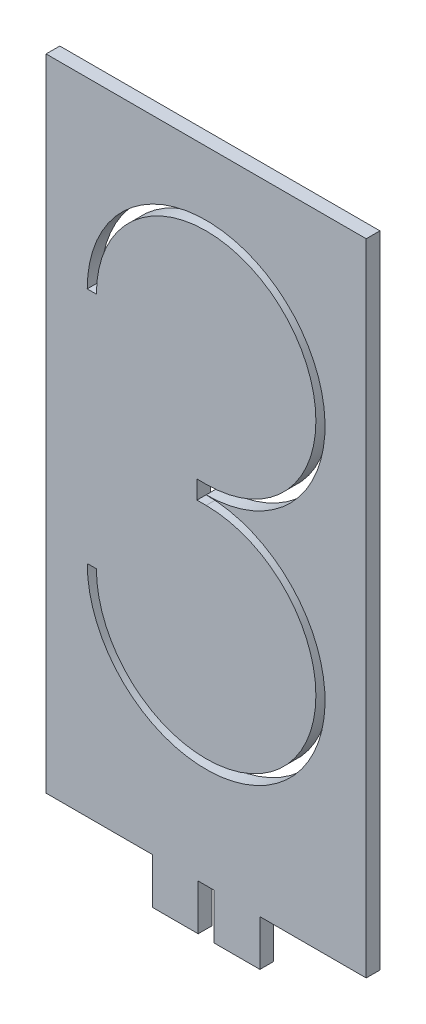
ISO-10303-21;
HEADER;
FILE_DESCRIPTION(('STEP AP214'),'2;1');
FILE_NAME('part.step','',(''),(''),'','','');
FILE_SCHEMA(('AUTOMOTIVE_DESIGN { 1 0 10303 214 1 1 1 1 }'));
ENDSEC;
DATA;
#1=APPLICATION_CONTEXT('core data for automotive mechanical design processes');
#2=APPLICATION_PROTOCOL_DEFINITION('international standard','automotive_design',2000,#1);
#3=PRODUCT_CONTEXT('',#1,'mechanical');
#4=PRODUCT('Part','Part','',(#3));
#5=PRODUCT_RELATED_PRODUCT_CATEGORY('part','',(#4));
#6=PRODUCT_DEFINITION_FORMATION('','',#4);
#7=PRODUCT_DEFINITION_CONTEXT('part definition',#1,'design');
#8=PRODUCT_DEFINITION('design','',#6,#7);
#9=PRODUCT_DEFINITION_SHAPE('','',#8);
#10=(LENGTH_UNIT() NAMED_UNIT(*) SI_UNIT(.MILLI.,.METRE.));
#11=(NAMED_UNIT(*) PLANE_ANGLE_UNIT() SI_UNIT($,.RADIAN.));
#12=(NAMED_UNIT(*) SI_UNIT($,.STERADIAN.) SOLID_ANGLE_UNIT());
#13=UNCERTAINTY_MEASURE_WITH_UNIT(LENGTH_MEASURE(1.E-05),#10,'distance_accuracy_value','');
#14=(GEOMETRIC_REPRESENTATION_CONTEXT(3) GLOBAL_UNCERTAINTY_ASSIGNED_CONTEXT((#13)) GLOBAL_UNIT_ASSIGNED_CONTEXT((#10,
#11,#12)) REPRESENTATION_CONTEXT('',''));
#15=CARTESIAN_POINT('',(0.,0.,0.));
#16=DIRECTION('',(0.,0.,1.));
#17=DIRECTION('',(1.,0.,0.));
#18=AXIS2_PLACEMENT_3D('',#15,#16,#17);
#19=CARTESIAN_POINT('',(0.,0.,1.5));
#20=DIRECTION('',(0.,1.,0.));
#21=DIRECTION('',(0.,0.,1.));
#22=AXIS2_PLACEMENT_3D('',#19,#20,#21);
#23=PLANE('',#22);
#24=DIRECTION('',(1.,0.,0.));
#25=VECTOR('',#24,1.);
#26=CARTESIAN_POINT('',(0.,0.,1.5));
#27=LINE('',#26,#25);
#28=CARTESIAN_POINT('',(11.63,0.,1.5));
#29=VERTEX_POINT('',#28);
#30=CARTESIAN_POINT('',(16.63,0.,1.5));
#31=VERTEX_POINT('',#30);
#32=EDGE_CURVE('E349',#29,#31,#27,.T.);
#33=ORIENTED_EDGE('',*,*,#32,.F.);
#34=DIRECTION('',(0.,0.,1.));
#35=VECTOR('',#34,1.);
#36=CARTESIAN_POINT('',(11.63,0.,0.));
#37=LINE('',#36,#35);
#38=CARTESIAN_POINT('',(11.63,0.,0.));
#39=VERTEX_POINT('',#38);
#40=EDGE_CURVE('E263',#39,#29,#37,.T.);
#41=ORIENTED_EDGE('',*,*,#40,.F.);
#42=DIRECTION('',(1.,0.,0.));
#43=VECTOR('',#42,1.);
#44=CARTESIAN_POINT('',(0.,0.,0.));
#45=LINE('',#44,#43);
#46=CARTESIAN_POINT('',(16.63,0.,0.));
#47=VERTEX_POINT('',#46);
#48=EDGE_CURVE('E364',#39,#47,#45,.T.);
#49=ORIENTED_EDGE('',*,*,#48,.T.);
#50=DIRECTION('',(0.,0.,1.));
#51=VECTOR('',#50,1.);
#52=CARTESIAN_POINT('',(16.63,0.,0.));
#53=LINE('',#52,#51);
#54=EDGE_CURVE('E319',#47,#31,#53,.T.);
#55=ORIENTED_EDGE('',*,*,#54,.T.);
#56=EDGE_LOOP('',(#33,#41,#49,#55));
#57=FACE_BOUND('',#56,.T.);
#58=ADVANCED_FACE('F39',(#57),#23,.F.);
#59=CARTESIAN_POINT('',(0.,0.,1.5));
#60=DIRECTION('',(1.,0.,0.));
#61=DIRECTION('',(0.,1.,0.));
#62=AXIS2_PLACEMENT_3D('',#59,#60,#61);
#63=PLANE('',#62);
#64=DIRECTION('',(0.,-1.,0.));
#65=VECTOR('',#64,1.);
#66=CARTESIAN_POINT('',(0.,0.,0.));
#67=LINE('',#66,#65);
#68=CARTESIAN_POINT('',(0.,75.,0.));
#69=VERTEX_POINT('',#68);
#70=CARTESIAN_POINT('',(0.,5.,0.));
#71=VERTEX_POINT('',#70);
#72=EDGE_CURVE('E275',#69,#71,#67,.T.);
#73=ORIENTED_EDGE('',*,*,#72,.T.);
#74=DIRECTION('',(0.,0.,1.));
#75=VECTOR('',#74,1.);
#76=CARTESIAN_POINT('',(0.,5.,0.));
#77=LINE('',#76,#75);
#78=CARTESIAN_POINT('',(0.,5.,1.5));
#79=VERTEX_POINT('',#78);
#80=EDGE_CURVE('E271',#71,#79,#77,.T.);
#81=ORIENTED_EDGE('',*,*,#80,.T.);
#82=DIRECTION('',(0.,-1.,0.));
#83=VECTOR('',#82,1.);
#84=CARTESIAN_POINT('',(0.,0.,1.5));
#85=LINE('',#84,#83);
#86=CARTESIAN_POINT('',(0.,75.,1.5));
#87=VERTEX_POINT('',#86);
#88=EDGE_CURVE('E340',#87,#79,#85,.T.);
#89=ORIENTED_EDGE('',*,*,#88,.F.);
#90=DIRECTION('',(0.,0.,-1.));
#91=VECTOR('',#90,1.);
#92=CARTESIAN_POINT('',(0.,75.,1.5));
#93=LINE('',#92,#91);
#94=EDGE_CURVE('E356',#87,#69,#93,.T.);
#95=ORIENTED_EDGE('',*,*,#94,.T.);
#96=EDGE_LOOP('',(#73,#81,#89,#95));
#97=FACE_BOUND('',#96,.T.);
#98=ADVANCED_FACE('F41',(#97),#63,.F.);
#99=CARTESIAN_POINT('',(18.38,0.,0.));
#100=VERTEX_POINT('',#99);
#101=CARTESIAN_POINT('',(23.38,0.,0.));
#102=VERTEX_POINT('',#101);
#103=EDGE_CURVE('E360',#100,#102,#45,.T.);
#104=ORIENTED_EDGE('',*,*,#103,.T.);
#105=DIRECTION('',(0.,0.,1.));
#106=VECTOR('',#105,1.);
#107=CARTESIAN_POINT('',(23.38,0.,0.));
#108=LINE('',#107,#106);
#109=CARTESIAN_POINT('',(23.38,0.,1.5));
#110=VERTEX_POINT('',#109);
#111=EDGE_CURVE('E290',#102,#110,#108,.T.);
#112=ORIENTED_EDGE('',*,*,#111,.T.);
#113=CARTESIAN_POINT('',(18.38,0.,1.5));
#114=VERTEX_POINT('',#113);
#115=EDGE_CURVE('E344',#114,#110,#27,.T.);
#116=ORIENTED_EDGE('',*,*,#115,.F.);
#117=DIRECTION('',(0.,0.,1.));
#118=VECTOR('',#117,1.);
#119=CARTESIAN_POINT('',(18.38,0.,0.));
#120=LINE('',#119,#118);
#121=EDGE_CURVE('E334',#100,#114,#120,.T.);
#122=ORIENTED_EDGE('',*,*,#121,.F.);
#123=EDGE_LOOP('',(#104,#112,#116,#122));
#124=FACE_BOUND('',#123,.T.);
#125=ADVANCED_FACE('F446',(#124),#23,.F.);
#126=CARTESIAN_POINT('',(35.,0.,1.5));
#127=DIRECTION('',(-1.,0.,0.));
#128=DIRECTION('',(0.,-1.,0.));
#129=AXIS2_PLACEMENT_3D('',#126,#127,#128);
#130=PLANE('',#129);
#131=DIRECTION('',(0.,1.,0.));
#132=VECTOR('',#131,1.);
#133=CARTESIAN_POINT('',(35.,0.,1.5));
#134=LINE('',#133,#132);
#135=CARTESIAN_POINT('',(35.,5.,1.5));
#136=VERTEX_POINT('',#135);
#137=CARTESIAN_POINT('',(35.,75.,1.5));
#138=VERTEX_POINT('',#137);
#139=EDGE_CURVE('E350',#136,#138,#134,.T.);
#140=ORIENTED_EDGE('',*,*,#139,.F.);
#141=DIRECTION('',(0.,0.,1.));
#142=VECTOR('',#141,1.);
#143=CARTESIAN_POINT('',(35.,5.,0.));
#144=LINE('',#143,#142);
#145=CARTESIAN_POINT('',(35.,5.,0.));
#146=VERTEX_POINT('',#145);
#147=EDGE_CURVE('E300',#146,#136,#144,.T.);
#148=ORIENTED_EDGE('',*,*,#147,.F.);
#149=DIRECTION('',(0.,1.,0.));
#150=VECTOR('',#149,1.);
#151=CARTESIAN_POINT('',(35.,0.,0.));
#152=LINE('',#151,#150);
#153=CARTESIAN_POINT('',(35.,75.,0.));
#154=VERTEX_POINT('',#153);
#155=EDGE_CURVE('E365',#146,#154,#152,.T.);
#156=ORIENTED_EDGE('',*,*,#155,.T.);
#157=DIRECTION('',(0.,0.,-1.));
#158=VECTOR('',#157,1.);
#159=CARTESIAN_POINT('',(35.,75.,1.5));
#160=LINE('',#159,#158);
#161=EDGE_CURVE('E373',#138,#154,#160,.T.);
#162=ORIENTED_EDGE('',*,*,#161,.F.);
#163=EDGE_LOOP('',(#140,#148,#156,#162));
#164=FACE_BOUND('',#163,.T.);
#165=ADVANCED_FACE('F454',(#164),#130,.F.);
#166=CARTESIAN_POINT('',(0.,75.,1.5));
#167=DIRECTION('',(0.,-1.,0.));
#168=DIRECTION('',(0.,0.,-1.));
#169=AXIS2_PLACEMENT_3D('',#166,#167,#168);
#170=PLANE('',#169);
#171=DIRECTION('',(-1.,0.,0.));
#172=VECTOR('',#171,1.);
#173=CARTESIAN_POINT('',(0.,75.,0.));
#174=LINE('',#173,#172);
#175=EDGE_CURVE('E345',#154,#69,#174,.T.);
#176=ORIENTED_EDGE('',*,*,#175,.T.);
#177=ORIENTED_EDGE('',*,*,#94,.F.);
#178=DIRECTION('',(-1.,0.,0.));
#179=VECTOR('',#178,1.);
#180=CARTESIAN_POINT('',(0.,75.,1.5));
#181=LINE('',#180,#179);
#182=EDGE_CURVE('E353',#138,#87,#181,.T.);
#183=ORIENTED_EDGE('',*,*,#182,.F.);
#184=ORIENTED_EDGE('',*,*,#161,.T.);
#185=EDGE_LOOP('',(#176,#177,#183,#184));
#186=FACE_BOUND('',#185,.T.);
#187=ADVANCED_FACE('F459',(#186),#170,.F.);
#188=CARTESIAN_POINT('',(0.,0.,1.5));
#189=DIRECTION('',(0.,0.,-1.));
#190=DIRECTION('',(-1.,0.,0.));
#191=AXIS2_PLACEMENT_3D('',#188,#189,#190);
#192=PLANE('',#191);
#193=DIRECTION('',(1.,0.,0.));
#194=VECTOR('',#193,1.);
#195=CARTESIAN_POINT('',(5.49999999999997,55.,1.5));
#196=LINE('',#195,#194);
#197=CARTESIAN_POINT('',(4.5,55.,1.5));
#198=VERTEX_POINT('',#197);
#199=CARTESIAN_POINT('',(5.49999999999997,55.,1.5));
#200=VERTEX_POINT('',#199);
#201=EDGE_CURVE('E195',#198,#200,#196,.T.);
#202=ORIENTED_EDGE('',*,*,#201,.F.);
#203=CARTESIAN_POINT('',(17.5,55.,1.5));
#204=DIRECTION('',(0.,0.,1.));
#205=DIRECTION('',(-1.,0.,0.));
#206=AXIS2_PLACEMENT_3D('',#203,#204,#205);
#207=CIRCLE('',#206,13.);
#208=CARTESIAN_POINT('',(17.5,42.,1.5));
#209=VERTEX_POINT('',#208);
#210=EDGE_CURVE('E55',#209,#198,#207,.T.);
#211=ORIENTED_EDGE('',*,*,#210,.F.);
#212=CARTESIAN_POINT('',(17.5,29.,1.5));
#213=DIRECTION('',(0.,0.,1.));
#214=DIRECTION('',(-1.,0.,0.));
#215=AXIS2_PLACEMENT_3D('',#212,#213,#214);
#216=CIRCLE('',#215,13.);
#217=CARTESIAN_POINT('',(4.49999999999997,29.,1.5));
#218=VERTEX_POINT('',#217);
#219=EDGE_CURVE('E227',#218,#209,#216,.T.);
#220=ORIENTED_EDGE('',*,*,#219,.F.);
#221=DIRECTION('',(-1.,0.,0.));
#222=VECTOR('',#221,1.);
#223=CARTESIAN_POINT('',(5.49999999999997,29.,1.5));
#224=LINE('',#223,#222);
#225=CARTESIAN_POINT('',(5.49999999999997,29.,1.5));
#226=VERTEX_POINT('',#225);
#227=EDGE_CURVE('E223',#226,#218,#224,.T.);
#228=ORIENTED_EDGE('',*,*,#227,.F.);
#229=CARTESIAN_POINT('',(17.5,29.,1.5));
#230=DIRECTION('',(0.,0.,-1.));
#231=DIRECTION('',(1.,0.,0.));
#232=AXIS2_PLACEMENT_3D('',#229,#230,#231);
#233=CIRCLE('',#232,12.);
#234=CARTESIAN_POINT('',(17.5,41.,1.5));
#235=VERTEX_POINT('',#234);
#236=EDGE_CURVE('E219',#235,#226,#233,.T.);
#237=ORIENTED_EDGE('',*,*,#236,.F.);
#238=DIRECTION('',(1.,0.,0.));
#239=VECTOR('',#238,1.);
#240=CARTESIAN_POINT('',(16.5,41.,1.5));
#241=LINE('',#240,#239);
#242=CARTESIAN_POINT('',(16.5,41.,1.5));
#243=VERTEX_POINT('',#242);
#244=EDGE_CURVE('E215',#243,#235,#241,.T.);
#245=ORIENTED_EDGE('',*,*,#244,.F.);
#246=DIRECTION('',(0.,-1.,0.));
#247=VECTOR('',#246,1.);
#248=CARTESIAN_POINT('',(16.5,43.,1.5));
#249=LINE('',#248,#247);
#250=CARTESIAN_POINT('',(16.5,43.,1.5));
#251=VERTEX_POINT('',#250);
#252=EDGE_CURVE('E208',#251,#243,#249,.T.);
#253=ORIENTED_EDGE('',*,*,#252,.F.);
#254=DIRECTION('',(-1.,0.,0.));
#255=VECTOR('',#254,1.);
#256=CARTESIAN_POINT('',(16.5,43.,1.5));
#257=LINE('',#256,#255);
#258=CARTESIAN_POINT('',(17.5,43.,1.5));
#259=VERTEX_POINT('',#258);
#260=EDGE_CURVE('E204',#259,#251,#257,.T.);
#261=ORIENTED_EDGE('',*,*,#260,.F.);
#262=CARTESIAN_POINT('',(17.5,55.,1.5));
#263=DIRECTION('',(0.,0.,-1.));
#264=DIRECTION('',(-1.,0.,0.));
#265=AXIS2_PLACEMENT_3D('',#262,#263,#264);
#266=CIRCLE('',#265,12.);
#267=EDGE_CURVE('E185',#200,#259,#266,.T.);
#268=ORIENTED_EDGE('',*,*,#267,.F.);
#269=EDGE_LOOP('',(#202,#211,#220,#228,#237,#245,#253,#261,#268));
#270=FACE_BOUND('',#269,.T.);
#271=ORIENTED_EDGE('',*,*,#88,.T.);
#272=DIRECTION('',(-1.,0.,0.));
#273=VECTOR('',#272,1.);
#274=CARTESIAN_POINT('',(0.,5.,1.5));
#275=LINE('',#274,#273);
#276=CARTESIAN_POINT('',(11.63,5.,1.5));
#277=VERTEX_POINT('',#276);
#278=EDGE_CURVE('E259',#277,#79,#275,.T.);
#279=ORIENTED_EDGE('',*,*,#278,.F.);
#280=DIRECTION('',(0.,1.,0.));
#281=VECTOR('',#280,1.);
#282=CARTESIAN_POINT('',(11.63,0.,1.5));
#283=LINE('',#282,#281);
#284=EDGE_CURVE('E264',#29,#277,#283,.T.);
#285=ORIENTED_EDGE('',*,*,#284,.F.);
#286=ORIENTED_EDGE('',*,*,#32,.T.);
#287=DIRECTION('',(0.,-1.,0.));
#288=VECTOR('',#287,1.);
#289=CARTESIAN_POINT('',(16.63,0.,1.5));
#290=LINE('',#289,#288);
#291=CARTESIAN_POINT('',(16.63,5.,1.5));
#292=VERTEX_POINT('',#291);
#293=EDGE_CURVE('E234',#292,#31,#290,.T.);
#294=ORIENTED_EDGE('',*,*,#293,.F.);
#295=DIRECTION('',(-1.,0.,0.));
#296=VECTOR('',#295,1.);
#297=CARTESIAN_POINT('',(16.63,5.,1.5));
#298=LINE('',#297,#296);
#299=CARTESIAN_POINT('',(18.38,5.,1.5));
#300=VERTEX_POINT('',#299);
#301=EDGE_CURVE('E311',#300,#292,#298,.T.);
#302=ORIENTED_EDGE('',*,*,#301,.F.);
#303=DIRECTION('',(0.,1.,0.));
#304=VECTOR('',#303,1.);
#305=CARTESIAN_POINT('',(18.38,0.,1.5));
#306=LINE('',#305,#304);
#307=EDGE_CURVE('E322',#114,#300,#306,.T.);
#308=ORIENTED_EDGE('',*,*,#307,.F.);
#309=ORIENTED_EDGE('',*,*,#115,.T.);
#310=DIRECTION('',(0.,-1.,0.));
#311=VECTOR('',#310,1.);
#312=CARTESIAN_POINT('',(23.38,5.,1.5));
#313=LINE('',#312,#311);
#314=CARTESIAN_POINT('',(23.38,5.,1.5));
#315=VERTEX_POINT('',#314);
#316=EDGE_CURVE('E291',#315,#110,#313,.T.);
#317=ORIENTED_EDGE('',*,*,#316,.F.);
#318=DIRECTION('',(-1.,0.,0.));
#319=VECTOR('',#318,1.);
#320=CARTESIAN_POINT('',(23.38,5.,1.5));
#321=LINE('',#320,#319);
#322=EDGE_CURVE('E286',#136,#315,#321,.T.);
#323=ORIENTED_EDGE('',*,*,#322,.F.);
#324=ORIENTED_EDGE('',*,*,#139,.T.);
#325=ORIENTED_EDGE('',*,*,#182,.T.);
#326=EDGE_LOOP('',(#271,#279,#285,#286,#294,#302,#308,#309,#317,#323,#324,#325));
#327=FACE_BOUND('',#326,.T.);
#328=ADVANCED_FACE('F200',(#270,#327),#192,.F.);
#329=CARTESIAN_POINT('',(0.,0.,0.));
#330=DIRECTION('',(0.,0.,-1.));
#331=DIRECTION('',(-1.,0.,0.));
#332=AXIS2_PLACEMENT_3D('',#329,#330,#331);
#333=PLANE('',#332);
#334=CARTESIAN_POINT('',(17.5,55.,0.));
#335=DIRECTION('',(0.,0.,-1.));
#336=DIRECTION('',(-1.,0.,0.));
#337=AXIS2_PLACEMENT_3D('',#334,#335,#336);
#338=CIRCLE('',#337,13.);
#339=CARTESIAN_POINT('',(4.5,55.,0.));
#340=VERTEX_POINT('',#339);
#341=CARTESIAN_POINT('',(17.5,42.,0.));
#342=VERTEX_POINT('',#341);
#343=EDGE_CURVE('E11',#340,#342,#338,.T.);
#344=ORIENTED_EDGE('',*,*,#343,.F.);
#345=DIRECTION('',(-1.,0.,0.));
#346=VECTOR('',#345,1.);
#347=CARTESIAN_POINT('',(7.63278329429823E-13,55.0000000000001,0.));
#348=LINE('',#347,#346);
#349=CARTESIAN_POINT('',(5.49999999999997,55.,0.));
#350=VERTEX_POINT('',#349);
#351=EDGE_CURVE('E377',#350,#340,#348,.T.);
#352=ORIENTED_EDGE('',*,*,#351,.F.);
#353=CARTESIAN_POINT('',(17.5,55.,0.));
#354=DIRECTION('',(0.,0.,-1.));
#355=DIRECTION('',(-1.,0.,0.));
#356=AXIS2_PLACEMENT_3D('',#353,#354,#355);
#357=CIRCLE('',#356,12.);
#358=CARTESIAN_POINT('',(17.5,43.,0.));
#359=VERTEX_POINT('',#358);
#360=EDGE_CURVE('E188',#359,#350,#357,.F.);
#361=ORIENTED_EDGE('',*,*,#360,.F.);
#362=DIRECTION('',(1.,0.,0.));
#363=VECTOR('',#362,1.);
#364=CARTESIAN_POINT('',(0.,43.,0.));
#365=LINE('',#364,#363);
#366=CARTESIAN_POINT('',(16.5,43.,0.));
#367=VERTEX_POINT('',#366);
#368=EDGE_CURVE('E382',#367,#359,#365,.T.);
#369=ORIENTED_EDGE('',*,*,#368,.F.);
#370=DIRECTION('',(0.,1.,0.));
#371=VECTOR('',#370,1.);
#372=CARTESIAN_POINT('',(16.5,0.,0.));
#373=LINE('',#372,#371);
#374=CARTESIAN_POINT('',(16.5,41.,0.));
#375=VERTEX_POINT('',#374);
#376=EDGE_CURVE('E385',#375,#367,#373,.T.);
#377=ORIENTED_EDGE('',*,*,#376,.F.);
#378=DIRECTION('',(-1.,0.,0.));
#379=VECTOR('',#378,1.);
#380=CARTESIAN_POINT('',(0.,41.,0.));
#381=LINE('',#380,#379);
#382=CARTESIAN_POINT('',(17.5,41.,0.));
#383=VERTEX_POINT('',#382);
#384=EDGE_CURVE('E388',#383,#375,#381,.T.);
#385=ORIENTED_EDGE('',*,*,#384,.F.);
#386=CARTESIAN_POINT('',(17.5,29.,0.));
#387=DIRECTION('',(0.,0.,-1.));
#388=DIRECTION('',(-1.,0.,0.));
#389=AXIS2_PLACEMENT_3D('',#386,#387,#388);
#390=CIRCLE('',#389,12.);
#391=CARTESIAN_POINT('',(5.49999999999997,29.,0.));
#392=VERTEX_POINT('',#391);
#393=EDGE_CURVE('E391',#392,#383,#390,.F.);
#394=ORIENTED_EDGE('',*,*,#393,.F.);
#395=DIRECTION('',(1.,0.,0.));
#396=VECTOR('',#395,1.);
#397=CARTESIAN_POINT('',(8.04911692853243E-13,29.0000000000001,0.));
#398=LINE('',#397,#396);
#399=CARTESIAN_POINT('',(4.49999999999997,29.,0.));
#400=VERTEX_POINT('',#399);
#401=EDGE_CURVE('E394',#400,#392,#398,.T.);
#402=ORIENTED_EDGE('',*,*,#401,.F.);
#403=CARTESIAN_POINT('',(17.5,29.,0.));
#404=DIRECTION('',(0.,0.,-1.));
#405=DIRECTION('',(-1.,0.,0.));
#406=AXIS2_PLACEMENT_3D('',#403,#404,#405);
#407=CIRCLE('',#406,13.);
#408=EDGE_CURVE('E48',#342,#400,#407,.T.);
#409=ORIENTED_EDGE('',*,*,#408,.F.);
#410=EDGE_LOOP('',(#344,#352,#361,#369,#377,#385,#394,#402,#409));
#411=FACE_BOUND('',#410,.T.);
#412=DIRECTION('',(-1.,0.,0.));
#413=VECTOR('',#412,1.);
#414=CARTESIAN_POINT('',(0.,5.,0.));
#415=LINE('',#414,#413);
#416=CARTESIAN_POINT('',(11.63,5.,0.));
#417=VERTEX_POINT('',#416);
#418=EDGE_CURVE('E258',#417,#71,#415,.T.);
#419=ORIENTED_EDGE('',*,*,#418,.T.);
#420=ORIENTED_EDGE('',*,*,#72,.F.);
#421=ORIENTED_EDGE('',*,*,#175,.F.);
#422=ORIENTED_EDGE('',*,*,#155,.F.);
#423=DIRECTION('',(-1.,0.,0.));
#424=VECTOR('',#423,1.);
#425=CARTESIAN_POINT('',(23.38,5.,0.));
#426=LINE('',#425,#424);
#427=CARTESIAN_POINT('',(23.38,5.,0.));
#428=VERTEX_POINT('',#427);
#429=EDGE_CURVE('E285',#146,#428,#426,.T.);
#430=ORIENTED_EDGE('',*,*,#429,.T.);
#431=DIRECTION('',(0.,-1.,0.));
#432=VECTOR('',#431,1.);
#433=CARTESIAN_POINT('',(23.38,5.,0.));
#434=LINE('',#433,#432);
#435=EDGE_CURVE('E281',#428,#102,#434,.T.);
#436=ORIENTED_EDGE('',*,*,#435,.T.);
#437=ORIENTED_EDGE('',*,*,#103,.F.);
#438=DIRECTION('',(0.,1.,0.));
#439=VECTOR('',#438,1.);
#440=CARTESIAN_POINT('',(18.38,0.,0.));
#441=LINE('',#440,#439);
#442=CARTESIAN_POINT('',(18.38,5.,0.));
#443=VERTEX_POINT('',#442);
#444=EDGE_CURVE('E310',#100,#443,#441,.T.);
#445=ORIENTED_EDGE('',*,*,#444,.T.);
#446=DIRECTION('',(-1.,0.,0.));
#447=VECTOR('',#446,1.);
#448=CARTESIAN_POINT('',(16.63,5.,0.));
#449=LINE('',#448,#447);
#450=CARTESIAN_POINT('',(16.63,5.,0.));
#451=VERTEX_POINT('',#450);
#452=EDGE_CURVE('E315',#443,#451,#449,.T.);
#453=ORIENTED_EDGE('',*,*,#452,.T.);
#454=DIRECTION('',(0.,-1.,0.));
#455=VECTOR('',#454,1.);
#456=CARTESIAN_POINT('',(16.63,0.,0.));
#457=LINE('',#456,#455);
#458=EDGE_CURVE('E306',#451,#47,#457,.T.);
#459=ORIENTED_EDGE('',*,*,#458,.T.);
#460=ORIENTED_EDGE('',*,*,#48,.F.);
#461=DIRECTION('',(0.,1.,0.));
#462=VECTOR('',#461,1.);
#463=CARTESIAN_POINT('',(11.63,0.,0.));
#464=LINE('',#463,#462);
#465=EDGE_CURVE('E254',#39,#417,#464,.T.);
#466=ORIENTED_EDGE('',*,*,#465,.T.);
#467=EDGE_LOOP('',(#419,#420,#421,#422,#430,#436,#437,#445,#453,#459,#460,#466));
#468=FACE_BOUND('',#467,.T.);
#469=ADVANCED_FACE('F411',(#411,#468),#333,.T.);
#470=CARTESIAN_POINT('',(16.63,0.,0.));
#471=DIRECTION('',(-1.,0.,0.));
#472=DIRECTION('',(0.,0.,1.));
#473=AXIS2_PLACEMENT_3D('',#470,#471,#472);
#474=PLANE('',#473);
#475=ORIENTED_EDGE('',*,*,#293,.T.);
#476=ORIENTED_EDGE('',*,*,#54,.F.);
#477=ORIENTED_EDGE('',*,*,#458,.F.);
#478=DIRECTION('',(0.,0.,1.));
#479=VECTOR('',#478,1.);
#480=CARTESIAN_POINT('',(16.63,5.,0.));
#481=LINE('',#480,#479);
#482=EDGE_CURVE('E294',#451,#292,#481,.T.);
#483=ORIENTED_EDGE('',*,*,#482,.T.);
#484=EDGE_LOOP('',(#475,#476,#477,#483));
#485=FACE_BOUND('',#484,.T.);
#486=ADVANCED_FACE('F509',(#485),#474,.F.);
#487=CARTESIAN_POINT('',(16.63,5.,0.));
#488=DIRECTION('',(0.,1.,0.));
#489=DIRECTION('',(0.,0.,1.));
#490=AXIS2_PLACEMENT_3D('',#487,#488,#489);
#491=PLANE('',#490);
#492=ORIENTED_EDGE('',*,*,#301,.T.);
#493=ORIENTED_EDGE('',*,*,#482,.F.);
#494=ORIENTED_EDGE('',*,*,#452,.F.);
#495=DIRECTION('',(0.,0.,1.));
#496=VECTOR('',#495,1.);
#497=CARTESIAN_POINT('',(18.38,5.,0.));
#498=LINE('',#497,#496);
#499=EDGE_CURVE('E331',#443,#300,#498,.T.);
#500=ORIENTED_EDGE('',*,*,#499,.T.);
#501=EDGE_LOOP('',(#492,#493,#494,#500));
#502=FACE_BOUND('',#501,.T.);
#503=ADVANCED_FACE('F481',(#502),#491,.F.);
#504=CARTESIAN_POINT('',(18.38,0.,0.));
#505=DIRECTION('',(1.,0.,0.));
#506=DIRECTION('',(0.,0.,-1.));
#507=AXIS2_PLACEMENT_3D('',#504,#505,#506);
#508=PLANE('',#507);
#509=ORIENTED_EDGE('',*,*,#307,.T.);
#510=ORIENTED_EDGE('',*,*,#499,.F.);
#511=ORIENTED_EDGE('',*,*,#444,.F.);
#512=ORIENTED_EDGE('',*,*,#121,.T.);
#513=EDGE_LOOP('',(#509,#510,#511,#512));
#514=FACE_BOUND('',#513,.T.);
#515=ADVANCED_FACE('F479',(#514),#508,.F.);
#516=CARTESIAN_POINT('',(23.38,5.,0.));
#517=DIRECTION('',(-1.,0.,0.));
#518=DIRECTION('',(0.,0.,1.));
#519=AXIS2_PLACEMENT_3D('',#516,#517,#518);
#520=PLANE('',#519);
#521=ORIENTED_EDGE('',*,*,#316,.T.);
#522=ORIENTED_EDGE('',*,*,#111,.F.);
#523=ORIENTED_EDGE('',*,*,#435,.F.);
#524=DIRECTION('',(0.,0.,1.));
#525=VECTOR('',#524,1.);
#526=CARTESIAN_POINT('',(23.38,5.,0.));
#527=LINE('',#526,#525);
#528=EDGE_CURVE('E268',#428,#315,#527,.T.);
#529=ORIENTED_EDGE('',*,*,#528,.T.);
#530=EDGE_LOOP('',(#521,#522,#523,#529));
#531=FACE_BOUND('',#530,.T.);
#532=ADVANCED_FACE('F467',(#531),#520,.F.);
#533=CARTESIAN_POINT('',(23.38,5.,0.));
#534=DIRECTION('',(0.,1.,0.));
#535=DIRECTION('',(0.,0.,1.));
#536=AXIS2_PLACEMENT_3D('',#533,#534,#535);
#537=PLANE('',#536);
#538=ORIENTED_EDGE('',*,*,#322,.T.);
#539=ORIENTED_EDGE('',*,*,#528,.F.);
#540=ORIENTED_EDGE('',*,*,#429,.F.);
#541=ORIENTED_EDGE('',*,*,#147,.T.);
#542=EDGE_LOOP('',(#538,#539,#540,#541));
#543=FACE_BOUND('',#542,.T.);
#544=ADVANCED_FACE('F469',(#543),#537,.F.);
#545=CARTESIAN_POINT('',(0.,5.,0.));
#546=DIRECTION('',(0.,1.,0.));
#547=DIRECTION('',(0.,0.,1.));
#548=AXIS2_PLACEMENT_3D('',#545,#546,#547);
#549=PLANE('',#548);
#550=ORIENTED_EDGE('',*,*,#278,.T.);
#551=ORIENTED_EDGE('',*,*,#80,.F.);
#552=ORIENTED_EDGE('',*,*,#418,.F.);
#553=DIRECTION('',(0.,0.,1.));
#554=VECTOR('',#553,1.);
#555=CARTESIAN_POINT('',(11.63,5.,0.));
#556=LINE('',#555,#554);
#557=EDGE_CURVE('E276',#417,#277,#556,.T.);
#558=ORIENTED_EDGE('',*,*,#557,.T.);
#559=EDGE_LOOP('',(#550,#551,#552,#558));
#560=FACE_BOUND('',#559,.T.);
#561=ADVANCED_FACE('F439',(#560),#549,.F.);
#562=CARTESIAN_POINT('',(11.63,0.,0.));
#563=DIRECTION('',(1.,0.,0.));
#564=DIRECTION('',(0.,1.,0.));
#565=AXIS2_PLACEMENT_3D('',#562,#563,#564);
#566=PLANE('',#565);
#567=ORIENTED_EDGE('',*,*,#284,.T.);
#568=ORIENTED_EDGE('',*,*,#557,.F.);
#569=ORIENTED_EDGE('',*,*,#465,.F.);
#570=ORIENTED_EDGE('',*,*,#40,.T.);
#571=EDGE_LOOP('',(#567,#568,#569,#570));
#572=FACE_BOUND('',#571,.T.);
#573=ADVANCED_FACE('F432',(#572),#566,.F.);
#574=CARTESIAN_POINT('',(17.5,55.,-18.5));
#575=DIRECTION('',(0.,0.,1.));
#576=DIRECTION('',(1.,0.,0.));
#577=AXIS2_PLACEMENT_3D('',#574,#575,#576);
#578=CYLINDRICAL_SURFACE('',#577,13.);
#579=ORIENTED_EDGE('',*,*,#343,.T.);
#580=DIRECTION('',(0.,0.,1.));
#581=VECTOR('',#580,1.);
#582=CARTESIAN_POINT('',(17.5,42.,-18.5));
#583=LINE('',#582,#581);
#584=EDGE_CURVE('E231',#342,#209,#583,.T.);
#585=ORIENTED_EDGE('',*,*,#584,.T.);
#586=ORIENTED_EDGE('',*,*,#210,.T.);
#587=DIRECTION('',(0.,0.,1.));
#588=VECTOR('',#587,1.);
#589=CARTESIAN_POINT('',(4.5,55.,-18.5));
#590=LINE('',#589,#588);
#591=EDGE_CURVE('E192',#340,#198,#590,.T.);
#592=ORIENTED_EDGE('',*,*,#591,.F.);
#593=EDGE_LOOP('',(#579,#585,#586,#592));
#594=FACE_BOUND('',#593,.T.);
#595=ADVANCED_FACE('F430',(#594),#578,.F.);
#596=CARTESIAN_POINT('',(17.5,29.,-18.5));
#597=DIRECTION('',(0.,0.,1.));
#598=DIRECTION('',(1.,0.,0.));
#599=AXIS2_PLACEMENT_3D('',#596,#597,#598);
#600=CYLINDRICAL_SURFACE('',#599,13.);
#601=ORIENTED_EDGE('',*,*,#408,.T.);
#602=DIRECTION('',(0.,0.,1.));
#603=VECTOR('',#602,1.);
#604=CARTESIAN_POINT('',(4.49999999999997,29.,-18.5));
#605=LINE('',#604,#603);
#606=EDGE_CURVE('E235',#400,#218,#605,.T.);
#607=ORIENTED_EDGE('',*,*,#606,.T.);
#608=ORIENTED_EDGE('',*,*,#219,.T.);
#609=ORIENTED_EDGE('',*,*,#584,.F.);
#610=EDGE_LOOP('',(#601,#607,#608,#609));
#611=FACE_BOUND('',#610,.T.);
#612=ADVANCED_FACE('F401',(#611),#600,.F.);
#613=CARTESIAN_POINT('',(5.49999999999997,29.,-18.5));
#614=DIRECTION('',(0.,1.,0.));
#615=DIRECTION('',(-1.,0.,0.));
#616=AXIS2_PLACEMENT_3D('',#613,#614,#615);
#617=PLANE('',#616);
#618=ORIENTED_EDGE('',*,*,#401,.T.);
#619=DIRECTION('',(0.,0.,1.));
#620=VECTOR('',#619,1.);
#621=CARTESIAN_POINT('',(5.49999999999997,29.,-18.5));
#622=LINE('',#621,#620);
#623=EDGE_CURVE('E238',#392,#226,#622,.T.);
#624=ORIENTED_EDGE('',*,*,#623,.T.);
#625=ORIENTED_EDGE('',*,*,#227,.T.);
#626=ORIENTED_EDGE('',*,*,#606,.F.);
#627=EDGE_LOOP('',(#618,#624,#625,#626));
#628=FACE_BOUND('',#627,.T.);
#629=ADVANCED_FACE('F406',(#628),#617,.F.);
#630=CARTESIAN_POINT('',(17.5,29.,-18.5));
#631=DIRECTION('',(0.,0.,1.));
#632=DIRECTION('',(1.,0.,0.));
#633=AXIS2_PLACEMENT_3D('',#630,#631,#632);
#634=CYLINDRICAL_SURFACE('',#633,12.);
#635=ORIENTED_EDGE('',*,*,#393,.T.);
#636=DIRECTION('',(0.,0.,1.));
#637=VECTOR('',#636,1.);
#638=CARTESIAN_POINT('',(17.5,41.,-18.5));
#639=LINE('',#638,#637);
#640=EDGE_CURVE('E241',#383,#235,#639,.T.);
#641=ORIENTED_EDGE('',*,*,#640,.T.);
#642=ORIENTED_EDGE('',*,*,#236,.T.);
#643=ORIENTED_EDGE('',*,*,#623,.F.);
#644=EDGE_LOOP('',(#635,#641,#642,#643));
#645=FACE_BOUND('',#644,.T.);
#646=ADVANCED_FACE('F417',(#645),#634,.T.);
#647=CARTESIAN_POINT('',(16.5,41.,-18.5));
#648=DIRECTION('',(0.,-1.,0.));
#649=DIRECTION('',(0.,0.,-1.));
#650=AXIS2_PLACEMENT_3D('',#647,#648,#649);
#651=PLANE('',#650);
#652=ORIENTED_EDGE('',*,*,#384,.T.);
#653=DIRECTION('',(0.,0.,1.));
#654=VECTOR('',#653,1.);
#655=CARTESIAN_POINT('',(16.5,41.,-18.5));
#656=LINE('',#655,#654);
#657=EDGE_CURVE('E244',#375,#243,#656,.T.);
#658=ORIENTED_EDGE('',*,*,#657,.T.);
#659=ORIENTED_EDGE('',*,*,#244,.T.);
#660=ORIENTED_EDGE('',*,*,#640,.F.);
#661=EDGE_LOOP('',(#652,#658,#659,#660));
#662=FACE_BOUND('',#661,.T.);
#663=ADVANCED_FACE('F419',(#662),#651,.F.);
#664=CARTESIAN_POINT('',(16.5,43.,-18.5));
#665=DIRECTION('',(-1.,0.,0.));
#666=DIRECTION('',(0.,0.,1.));
#667=AXIS2_PLACEMENT_3D('',#664,#665,#666);
#668=PLANE('',#667);
#669=ORIENTED_EDGE('',*,*,#376,.T.);
#670=DIRECTION('',(0.,0.,1.));
#671=VECTOR('',#670,1.);
#672=CARTESIAN_POINT('',(16.5,43.,-18.5));
#673=LINE('',#672,#671);
#674=EDGE_CURVE('E247',#367,#251,#673,.T.);
#675=ORIENTED_EDGE('',*,*,#674,.T.);
#676=ORIENTED_EDGE('',*,*,#252,.T.);
#677=ORIENTED_EDGE('',*,*,#657,.F.);
#678=EDGE_LOOP('',(#669,#675,#676,#677));
#679=FACE_BOUND('',#678,.T.);
#680=ADVANCED_FACE('F425',(#679),#668,.F.);
#681=CARTESIAN_POINT('',(16.5,43.,-18.5));
#682=DIRECTION('',(0.,1.,0.));
#683=DIRECTION('',(0.,0.,1.));
#684=AXIS2_PLACEMENT_3D('',#681,#682,#683);
#685=PLANE('',#684);
#686=ORIENTED_EDGE('',*,*,#368,.T.);
#687=DIRECTION('',(0.,0.,1.));
#688=VECTOR('',#687,1.);
#689=CARTESIAN_POINT('',(17.5,43.,-18.5));
#690=LINE('',#689,#688);
#691=EDGE_CURVE('E191',#359,#259,#690,.T.);
#692=ORIENTED_EDGE('',*,*,#691,.T.);
#693=ORIENTED_EDGE('',*,*,#260,.T.);
#694=ORIENTED_EDGE('',*,*,#674,.F.);
#695=EDGE_LOOP('',(#686,#692,#693,#694));
#696=FACE_BOUND('',#695,.T.);
#697=ADVANCED_FACE('F429',(#696),#685,.F.);
#698=CARTESIAN_POINT('',(17.5,55.,-18.5));
#699=DIRECTION('',(0.,0.,1.));
#700=DIRECTION('',(1.,0.,0.));
#701=AXIS2_PLACEMENT_3D('',#698,#699,#700);
#702=CYLINDRICAL_SURFACE('',#701,12.);
#703=ORIENTED_EDGE('',*,*,#360,.T.);
#704=DIRECTION('',(0.,0.,1.));
#705=VECTOR('',#704,1.);
#706=CARTESIAN_POINT('',(5.49999999999997,55.,-18.5));
#707=LINE('',#706,#705);
#708=EDGE_CURVE('E63',#350,#200,#707,.T.);
#709=ORIENTED_EDGE('',*,*,#708,.T.);
#710=ORIENTED_EDGE('',*,*,#267,.T.);
#711=ORIENTED_EDGE('',*,*,#691,.F.);
#712=EDGE_LOOP('',(#703,#709,#710,#711));
#713=FACE_BOUND('',#712,.T.);
#714=ADVANCED_FACE('F182',(#713),#702,.T.);
#715=CARTESIAN_POINT('',(5.49999999999997,55.,-18.5));
#716=DIRECTION('',(0.,-1.,0.));
#717=DIRECTION('',(1.,0.,0.));
#718=AXIS2_PLACEMENT_3D('',#715,#716,#717);
#719=PLANE('',#718);
#720=ORIENTED_EDGE('',*,*,#351,.T.);
#721=ORIENTED_EDGE('',*,*,#591,.T.);
#722=ORIENTED_EDGE('',*,*,#201,.T.);
#723=ORIENTED_EDGE('',*,*,#708,.F.);
#724=EDGE_LOOP('',(#720,#721,#722,#723));
#725=FACE_BOUND('',#724,.T.);
#726=ADVANCED_FACE('F196',(#725),#719,.F.);
#727=CLOSED_SHELL('',(#58,#98,#125,#165,#187,#328,#469,#486,#503,#515,#532,#544,#561,#573,#595,
#612,#629,#646,#663,#680,#697,#714,#726));
#728=MANIFOLD_SOLID_BREP('B2',#727);
#729=ADVANCED_BREP_SHAPE_REPRESENTATION('',(#18,#728),#14);
#730=SHAPE_DEFINITION_REPRESENTATION(#9,#729);
ENDSEC;
END-ISO-10303-21;
